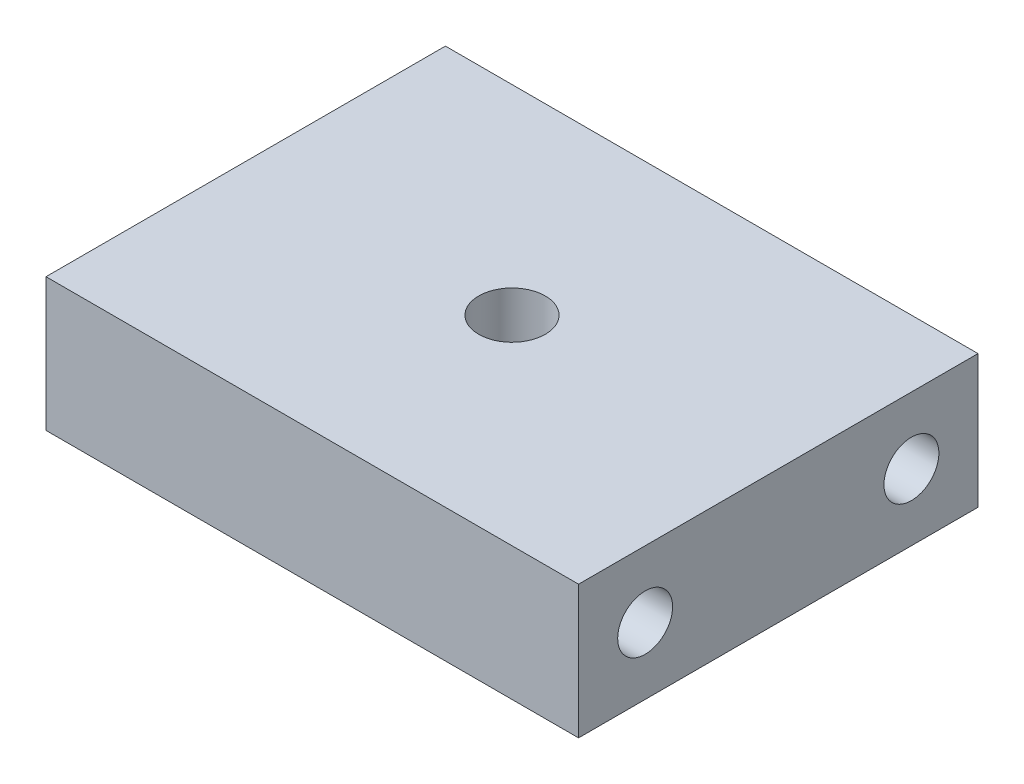
ISO-10303-21;
HEADER;
FILE_DESCRIPTION(('STEP AP214'),'2;1');
FILE_NAME('part.step','',(''),(''),'','','');
FILE_SCHEMA(('AUTOMOTIVE_DESIGN { 1 0 10303 214 1 1 1 1 }'));
ENDSEC;
DATA;
#1=APPLICATION_CONTEXT('core data for automotive mechanical design processes');
#2=APPLICATION_PROTOCOL_DEFINITION('international standard','automotive_design',2000,#1);
#3=PRODUCT_CONTEXT('',#1,'mechanical');
#4=PRODUCT('Part','Part','',(#3));
#5=PRODUCT_RELATED_PRODUCT_CATEGORY('part','',(#4));
#6=PRODUCT_DEFINITION_FORMATION('','',#4);
#7=PRODUCT_DEFINITION_CONTEXT('part definition',#1,'design');
#8=PRODUCT_DEFINITION('design','',#6,#7);
#9=PRODUCT_DEFINITION_SHAPE('','',#8);
#10=(LENGTH_UNIT() NAMED_UNIT(*) SI_UNIT(.MILLI.,.METRE.));
#11=(NAMED_UNIT(*) PLANE_ANGLE_UNIT() SI_UNIT($,.RADIAN.));
#12=(NAMED_UNIT(*) SI_UNIT($,.STERADIAN.) SOLID_ANGLE_UNIT());
#13=UNCERTAINTY_MEASURE_WITH_UNIT(LENGTH_MEASURE(1.E-05),#10,'distance_accuracy_value','');
#14=(GEOMETRIC_REPRESENTATION_CONTEXT(3) GLOBAL_UNCERTAINTY_ASSIGNED_CONTEXT((#13)) GLOBAL_UNIT_ASSIGNED_CONTEXT((#10,
#11,#12)) REPRESENTATION_CONTEXT('',''));
#15=CARTESIAN_POINT('',(0.,0.,0.));
#16=DIRECTION('',(0.,0.,1.));
#17=DIRECTION('',(1.,0.,0.));
#18=AXIS2_PLACEMENT_3D('',#15,#16,#17);
#19=CARTESIAN_POINT('',(19.1264367816092,8.,10.7586206896552));
#20=DIRECTION('',(-1.,0.,0.));
#21=DIRECTION('',(0.,0.,1.));
#22=AXIS2_PLACEMENT_3D('',#19,#20,#21);
#23=PLANE('',#22);
#24=CARTESIAN_POINT('',(19.1264367816092,4.,6.75862068965517));
#25=DIRECTION('',(-1.,0.,0.));
#26=DIRECTION('',(0.,0.,1.));
#27=AXIS2_PLACEMENT_3D('',#24,#25,#26);
#28=CIRCLE('',#27,1.65);
#29=CARTESIAN_POINT('',(19.1264367816092,4.,8.40862068965517));
#30=VERTEX_POINT('',#29);
#31=EDGE_CURVE('E143',#30,#30,#28,.F.);
#32=ORIENTED_EDGE('',*,*,#31,.F.);
#33=EDGE_LOOP('',(#32));
#34=FACE_BOUND('',#33,.T.);
#35=CARTESIAN_POINT('',(19.1264367816092,4.,-9.24137931034483));
#36=DIRECTION('',(-1.,0.,0.));
#37=DIRECTION('',(0.,0.,1.));
#38=AXIS2_PLACEMENT_3D('',#35,#36,#37);
#39=CIRCLE('',#38,1.65);
#40=CARTESIAN_POINT('',(19.1264367816092,4.,-7.59137931034483));
#41=VERTEX_POINT('',#40);
#42=EDGE_CURVE('E132',#41,#41,#39,.F.);
#43=ORIENTED_EDGE('',*,*,#42,.F.);
#44=EDGE_LOOP('',(#43));
#45=FACE_BOUND('',#44,.T.);
#46=DIRECTION('',(0.,0.,-1.));
#47=VECTOR('',#46,1.);
#48=CARTESIAN_POINT('',(19.1264367816092,0.,10.7586206896552));
#49=LINE('',#48,#47);
#50=CARTESIAN_POINT('',(19.1264367816092,0.,10.7586206896552));
#51=VERTEX_POINT('',#50);
#52=CARTESIAN_POINT('',(19.1264367816092,0.,-13.2413793103448));
#53=VERTEX_POINT('',#52);
#54=EDGE_CURVE('E107',#51,#53,#49,.T.);
#55=ORIENTED_EDGE('',*,*,#54,.T.);
#56=DIRECTION('',(0.,-1.,0.));
#57=VECTOR('',#56,1.);
#58=CARTESIAN_POINT('',(19.1264367816092,8.,-13.2413793103448));
#59=LINE('',#58,#57);
#60=CARTESIAN_POINT('',(19.1264367816092,8.,-13.2413793103448));
#61=VERTEX_POINT('',#60);
#62=EDGE_CURVE('E11',#61,#53,#59,.T.);
#63=ORIENTED_EDGE('',*,*,#62,.F.);
#64=DIRECTION('',(0.,0.,-1.));
#65=VECTOR('',#64,1.);
#66=CARTESIAN_POINT('',(19.1264367816092,8.,10.7586206896552));
#67=LINE('',#66,#65);
#68=CARTESIAN_POINT('',(19.1264367816092,8.,10.7586206896552));
#69=VERTEX_POINT('',#68);
#70=EDGE_CURVE('E91',#69,#61,#67,.T.);
#71=ORIENTED_EDGE('',*,*,#70,.F.);
#72=DIRECTION('',(0.,-1.,0.));
#73=VECTOR('',#72,1.);
#74=CARTESIAN_POINT('',(19.1264367816092,8.,10.7586206896552));
#75=LINE('',#74,#73);
#76=EDGE_CURVE('E103',#69,#51,#75,.T.);
#77=ORIENTED_EDGE('',*,*,#76,.T.);
#78=EDGE_LOOP('',(#55,#63,#71,#77));
#79=FACE_BOUND('',#78,.T.);
#80=ADVANCED_FACE('F39',(#34,#45,#79),#23,.F.);
#81=CARTESIAN_POINT('',(19.1264367816092,8.,-13.2413793103448));
#82=DIRECTION('',(0.,0.,1.));
#83=DIRECTION('',(1.,0.,0.));
#84=AXIS2_PLACEMENT_3D('',#81,#82,#83);
#85=PLANE('',#84);
#86=DIRECTION('',(-1.,0.,0.));
#87=VECTOR('',#86,1.);
#88=CARTESIAN_POINT('',(19.1264367816092,0.,-13.2413793103448));
#89=LINE('',#88,#87);
#90=CARTESIAN_POINT('',(-12.8735632183908,0.,-13.2413793103448));
#91=VERTEX_POINT('',#90);
#92=EDGE_CURVE('E96',#53,#91,#89,.T.);
#93=ORIENTED_EDGE('',*,*,#92,.T.);
#94=DIRECTION('',(0.,-1.,0.));
#95=VECTOR('',#94,1.);
#96=CARTESIAN_POINT('',(-12.8735632183908,8.,-13.2413793103448));
#97=LINE('',#96,#95);
#98=CARTESIAN_POINT('',(-12.8735632183908,8.,-13.2413793103448));
#99=VERTEX_POINT('',#98);
#100=EDGE_CURVE('E48',#99,#91,#97,.T.);
#101=ORIENTED_EDGE('',*,*,#100,.F.);
#102=DIRECTION('',(-1.,0.,0.));
#103=VECTOR('',#102,1.);
#104=CARTESIAN_POINT('',(19.1264367816092,8.,-13.2413793103448));
#105=LINE('',#104,#103);
#106=EDGE_CURVE('E86',#61,#99,#105,.T.);
#107=ORIENTED_EDGE('',*,*,#106,.F.);
#108=ORIENTED_EDGE('',*,*,#62,.T.);
#109=EDGE_LOOP('',(#93,#101,#107,#108));
#110=FACE_BOUND('',#109,.T.);
#111=ADVANCED_FACE('F95',(#110),#85,.F.);
#112=CARTESIAN_POINT('',(-12.8735632183908,8.,10.7586206896552));
#113=DIRECTION('',(1.,0.,0.));
#114=DIRECTION('',(0.,0.,-1.));
#115=AXIS2_PLACEMENT_3D('',#112,#113,#114);
#116=PLANE('',#115);
#117=CARTESIAN_POINT('',(-12.8735632183908,4.,6.75862068965517));
#118=DIRECTION('',(-1.,0.,0.));
#119=DIRECTION('',(0.,0.,1.));
#120=AXIS2_PLACEMENT_3D('',#117,#118,#119);
#121=CIRCLE('',#120,1.65);
#122=CARTESIAN_POINT('',(-12.8735632183908,4.,8.40862068965517));
#123=VERTEX_POINT('',#122);
#124=EDGE_CURVE('E147',#123,#123,#121,.T.);
#125=ORIENTED_EDGE('',*,*,#124,.F.);
#126=EDGE_LOOP('',(#125));
#127=FACE_BOUND('',#126,.T.);
#128=CARTESIAN_POINT('',(-12.8735632183908,4.,-9.24137931034483));
#129=DIRECTION('',(-1.,0.,0.));
#130=DIRECTION('',(0.,0.,1.));
#131=AXIS2_PLACEMENT_3D('',#128,#129,#130);
#132=CIRCLE('',#131,1.65);
#133=CARTESIAN_POINT('',(-12.8735632183908,4.,-7.59137931034483));
#134=VERTEX_POINT('',#133);
#135=EDGE_CURVE('E139',#134,#134,#132,.T.);
#136=ORIENTED_EDGE('',*,*,#135,.F.);
#137=EDGE_LOOP('',(#136));
#138=FACE_BOUND('',#137,.T.);
#139=DIRECTION('',(0.,0.,1.));
#140=VECTOR('',#139,1.);
#141=CARTESIAN_POINT('',(-12.8735632183908,0.,10.7586206896552));
#142=LINE('',#141,#140);
#143=CARTESIAN_POINT('',(-12.8735632183908,0.,10.7586206896552));
#144=VERTEX_POINT('',#143);
#145=EDGE_CURVE('E73',#91,#144,#142,.T.);
#146=ORIENTED_EDGE('',*,*,#145,.T.);
#147=DIRECTION('',(0.,-1.,0.));
#148=VECTOR('',#147,1.);
#149=CARTESIAN_POINT('',(-12.8735632183908,8.,10.7586206896552));
#150=LINE('',#149,#148);
#151=CARTESIAN_POINT('',(-12.8735632183908,8.,10.7586206896552));
#152=VERTEX_POINT('',#151);
#153=EDGE_CURVE('E98',#152,#144,#150,.T.);
#154=ORIENTED_EDGE('',*,*,#153,.F.);
#155=DIRECTION('',(0.,0.,1.));
#156=VECTOR('',#155,1.);
#157=CARTESIAN_POINT('',(-12.8735632183908,8.,10.7586206896552));
#158=LINE('',#157,#156);
#159=EDGE_CURVE('E89',#99,#152,#158,.T.);
#160=ORIENTED_EDGE('',*,*,#159,.F.);
#161=ORIENTED_EDGE('',*,*,#100,.T.);
#162=EDGE_LOOP('',(#146,#154,#160,#161));
#163=FACE_BOUND('',#162,.T.);
#164=ADVANCED_FACE('F99',(#127,#138,#163),#116,.F.);
#165=CARTESIAN_POINT('',(19.1264367816092,8.,10.7586206896552));
#166=DIRECTION('',(0.,0.,-1.));
#167=DIRECTION('',(-1.,0.,0.));
#168=AXIS2_PLACEMENT_3D('',#165,#166,#167);
#169=PLANE('',#168);
#170=DIRECTION('',(1.,0.,0.));
#171=VECTOR('',#170,1.);
#172=CARTESIAN_POINT('',(19.1264367816092,0.,10.7586206896552));
#173=LINE('',#172,#171);
#174=EDGE_CURVE('E79',#144,#51,#173,.T.);
#175=ORIENTED_EDGE('',*,*,#174,.T.);
#176=ORIENTED_EDGE('',*,*,#76,.F.);
#177=DIRECTION('',(1.,0.,0.));
#178=VECTOR('',#177,1.);
#179=CARTESIAN_POINT('',(19.1264367816092,8.,10.7586206896552));
#180=LINE('',#179,#178);
#181=EDGE_CURVE('E56',#152,#69,#180,.T.);
#182=ORIENTED_EDGE('',*,*,#181,.F.);
#183=ORIENTED_EDGE('',*,*,#153,.T.);
#184=EDGE_LOOP('',(#175,#176,#182,#183));
#185=FACE_BOUND('',#184,.T.);
#186=ADVANCED_FACE('F121',(#185),#169,.F.);
#187=CARTESIAN_POINT('',(0.,8.,0.));
#188=DIRECTION('',(0.,1.,0.));
#189=DIRECTION('',(0.,0.,1.));
#190=AXIS2_PLACEMENT_3D('',#187,#188,#189);
#191=PLANE('',#190);
#192=CARTESIAN_POINT('',(3.12643678160919,8.,-1.24137931034483));
#193=DIRECTION('',(0.,1.,0.));
#194=DIRECTION('',(0.,0.,1.));
#195=AXIS2_PLACEMENT_3D('',#192,#193,#194);
#196=CIRCLE('',#195,2.);
#197=CARTESIAN_POINT('',(3.12643678160919,8.,0.758620689655173));
#198=VERTEX_POINT('',#197);
#199=EDGE_CURVE('E128',#198,#198,#196,.T.);
#200=ORIENTED_EDGE('',*,*,#199,.F.);
#201=EDGE_LOOP('',(#200));
#202=FACE_BOUND('',#201,.T.);
#203=ORIENTED_EDGE('',*,*,#70,.T.);
#204=ORIENTED_EDGE('',*,*,#106,.T.);
#205=ORIENTED_EDGE('',*,*,#159,.T.);
#206=ORIENTED_EDGE('',*,*,#181,.T.);
#207=EDGE_LOOP('',(#203,#204,#205,#206));
#208=FACE_BOUND('',#207,.T.);
#209=ADVANCED_FACE('F87',(#202,#208),#191,.T.);
#210=CARTESIAN_POINT('',(0.,0.,0.));
#211=DIRECTION('',(0.,1.,0.));
#212=DIRECTION('',(0.,0.,1.));
#213=AXIS2_PLACEMENT_3D('',#210,#211,#212);
#214=PLANE('',#213);
#215=CARTESIAN_POINT('',(3.12643678160919,0.,-1.24137931034483));
#216=DIRECTION('',(0.,1.,0.));
#217=DIRECTION('',(0.,0.,1.));
#218=AXIS2_PLACEMENT_3D('',#215,#216,#217);
#219=CIRCLE('',#218,2.);
#220=CARTESIAN_POINT('',(3.12643678160919,0.,0.758620689655173));
#221=VERTEX_POINT('',#220);
#222=EDGE_CURVE('E111',#221,#221,#219,.T.);
#223=ORIENTED_EDGE('',*,*,#222,.T.);
#224=EDGE_LOOP('',(#223));
#225=FACE_BOUND('',#224,.T.);
#226=ORIENTED_EDGE('',*,*,#54,.F.);
#227=ORIENTED_EDGE('',*,*,#174,.F.);
#228=ORIENTED_EDGE('',*,*,#145,.F.);
#229=ORIENTED_EDGE('',*,*,#92,.F.);
#230=EDGE_LOOP('',(#226,#227,#228,#229));
#231=FACE_BOUND('',#230,.T.);
#232=ADVANCED_FACE('F124',(#225,#231),#214,.F.);
#233=CARTESIAN_POINT('',(3.12643678160919,0.,-1.24137931034483));
#234=DIRECTION('',(0.,1.,0.));
#235=DIRECTION('',(0.,0.,1.));
#236=AXIS2_PLACEMENT_3D('',#233,#234,#235);
#237=CYLINDRICAL_SURFACE('',#236,2.);
#238=ORIENTED_EDGE('',*,*,#222,.F.);
#239=EDGE_LOOP('',(#238));
#240=FACE_BOUND('',#239,.T.);
#241=ORIENTED_EDGE('',*,*,#199,.T.);
#242=EDGE_LOOP('',(#241));
#243=FACE_BOUND('',#242,.T.);
#244=ADVANCED_FACE('F163',(#240,#243),#237,.F.);
#245=CARTESIAN_POINT('',(19.1274367816092,4.,-9.24137931034483));
#246=DIRECTION('',(-1.,0.,0.));
#247=DIRECTION('',(0.,0.,1.));
#248=AXIS2_PLACEMENT_3D('',#245,#246,#247);
#249=CYLINDRICAL_SURFACE('',#248,1.65);
#250=ORIENTED_EDGE('',*,*,#135,.T.);
#251=EDGE_LOOP('',(#250));
#252=FACE_BOUND('',#251,.T.);
#253=ORIENTED_EDGE('',*,*,#42,.T.);
#254=EDGE_LOOP('',(#253));
#255=FACE_BOUND('',#254,.T.);
#256=ADVANCED_FACE('F160',(#252,#255),#249,.F.);
#257=CARTESIAN_POINT('',(19.1274367816092,4.,6.75862068965517));
#258=DIRECTION('',(-1.,0.,0.));
#259=DIRECTION('',(0.,0.,1.));
#260=AXIS2_PLACEMENT_3D('',#257,#258,#259);
#261=CYLINDRICAL_SURFACE('',#260,1.65);
#262=ORIENTED_EDGE('',*,*,#124,.T.);
#263=EDGE_LOOP('',(#262));
#264=FACE_BOUND('',#263,.T.);
#265=ORIENTED_EDGE('',*,*,#31,.T.);
#266=EDGE_LOOP('',(#265));
#267=FACE_BOUND('',#266,.T.);
#268=ADVANCED_FACE('F152',(#264,#267),#261,.F.);
#269=CLOSED_SHELL('',(#80,#111,#164,#186,#209,#232,#244,#256,#268));
#270=MANIFOLD_SOLID_BREP('B2',#269);
#271=ADVANCED_BREP_SHAPE_REPRESENTATION('',(#18,#270),#14);
#272=SHAPE_DEFINITION_REPRESENTATION(#9,#271);
ENDSEC;
END-ISO-10303-21;
